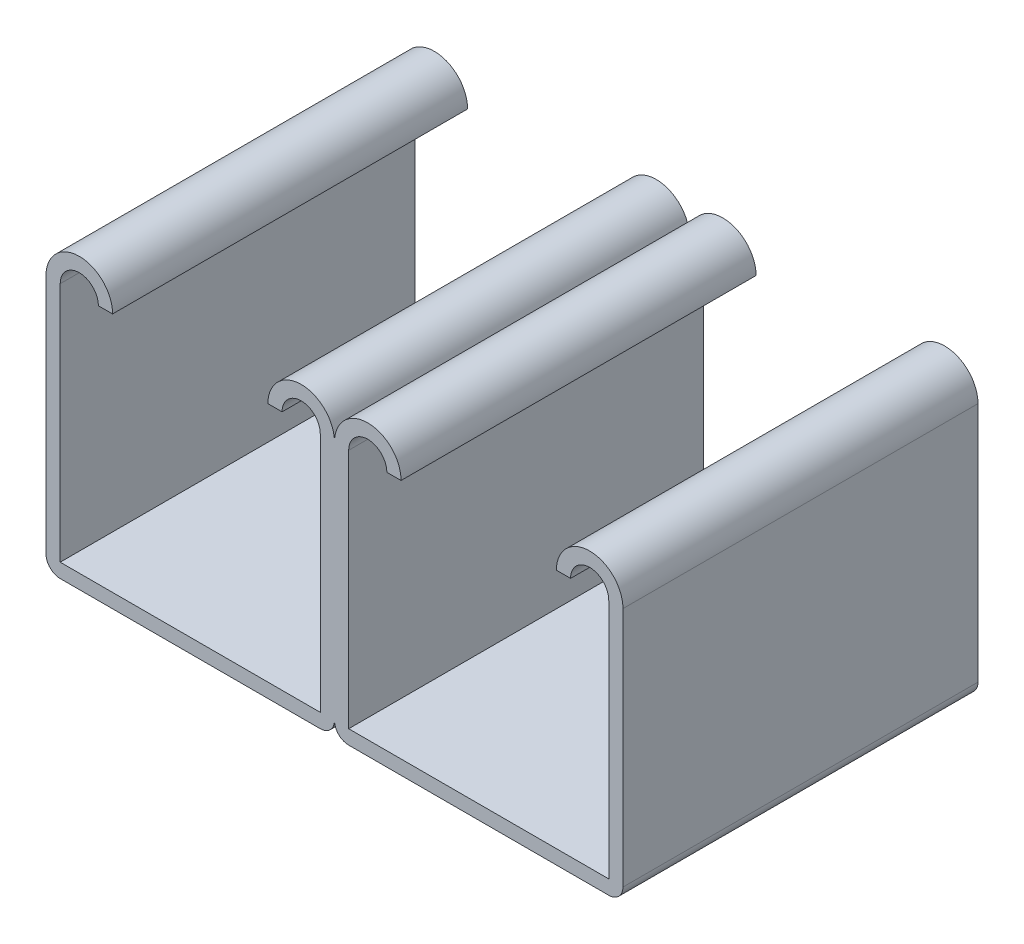
ISO-10303-21;
HEADER;
FILE_DESCRIPTION(('STEP AP214'),'2;1');
FILE_NAME('part.step','',(''),(''),'','','');
FILE_SCHEMA(('AUTOMOTIVE_DESIGN { 1 0 10303 214 1 1 1 1 }'));
ENDSEC;
DATA;
#1=APPLICATION_CONTEXT('core data for automotive mechanical design processes');
#2=APPLICATION_PROTOCOL_DEFINITION('international standard','automotive_design',2000,#1);
#3=PRODUCT_CONTEXT('',#1,'mechanical');
#4=PRODUCT('Part','Part','',(#3));
#5=PRODUCT_RELATED_PRODUCT_CATEGORY('part','',(#4));
#6=PRODUCT_DEFINITION_FORMATION('','',#4);
#7=PRODUCT_DEFINITION_CONTEXT('part definition',#1,'design');
#8=PRODUCT_DEFINITION('design','',#6,#7);
#9=PRODUCT_DEFINITION_SHAPE('','',#8);
#10=(LENGTH_UNIT() NAMED_UNIT(*) SI_UNIT(.MILLI.,.METRE.));
#11=(NAMED_UNIT(*) PLANE_ANGLE_UNIT() SI_UNIT($,.RADIAN.));
#12=(NAMED_UNIT(*) SI_UNIT($,.STERADIAN.) SOLID_ANGLE_UNIT());
#13=UNCERTAINTY_MEASURE_WITH_UNIT(LENGTH_MEASURE(1.E-05),#10,'distance_accuracy_value','');
#14=(GEOMETRIC_REPRESENTATION_CONTEXT(3) GLOBAL_UNCERTAINTY_ASSIGNED_CONTEXT((#13)) GLOBAL_UNIT_ASSIGNED_CONTEXT((#10,
#11,#12)) REPRESENTATION_CONTEXT('',''));
#15=CARTESIAN_POINT('',(0.,0.,0.));
#16=DIRECTION('',(0.,0.,1.));
#17=DIRECTION('',(1.,0.,0.));
#18=AXIS2_PLACEMENT_3D('',#15,#16,#17);
#19=CARTESIAN_POINT('',(-18.25625,9.37895,12.7));
#20=DIRECTION('',(0.,0.,-1.));
#21=DIRECTION('',(-1.,0.,0.));
#22=AXIS2_PLACEMENT_3D('',#19,#20,#21);
#23=CYLINDRICAL_SURFACE('',#22,2.38125);
#24=CARTESIAN_POINT('',(-18.25625,9.37895,-12.7));
#25=DIRECTION('',(0.,0.,1.));
#26=DIRECTION('',(-1.,0.,0.));
#27=AXIS2_PLACEMENT_3D('',#24,#25,#26);
#28=CIRCLE('',#27,2.38125);
#29=CARTESIAN_POINT('',(-15.875,9.37895,-12.7));
#30=VERTEX_POINT('',#29);
#31=CARTESIAN_POINT('',(-20.6375,9.37895,-12.7));
#32=VERTEX_POINT('',#31);
#33=EDGE_CURVE('E165',#30,#32,#28,.T.);
#34=ORIENTED_EDGE('',*,*,#33,.T.);
#35=DIRECTION('',(0.,0.,-1.));
#36=VECTOR('',#35,1.);
#37=CARTESIAN_POINT('',(-20.6375,9.37895,12.7));
#38=LINE('',#37,#36);
#39=CARTESIAN_POINT('',(-20.6375,9.37895,12.7));
#40=VERTEX_POINT('',#39);
#41=EDGE_CURVE('E11',#40,#32,#38,.T.);
#42=ORIENTED_EDGE('',*,*,#41,.F.);
#43=CARTESIAN_POINT('',(-18.25625,9.37895,12.7));
#44=DIRECTION('',(0.,0.,1.));
#45=DIRECTION('',(-1.,0.,0.));
#46=AXIS2_PLACEMENT_3D('',#43,#44,#45);
#47=CIRCLE('',#46,2.38125);
#48=CARTESIAN_POINT('',(-15.875,9.37895,12.7));
#49=VERTEX_POINT('',#48);
#50=EDGE_CURVE('E190',#49,#40,#47,.T.);
#51=ORIENTED_EDGE('',*,*,#50,.F.);
#52=DIRECTION('',(0.,0.,-1.));
#53=VECTOR('',#52,1.);
#54=CARTESIAN_POINT('',(-15.875,9.37895,12.7));
#55=LINE('',#54,#53);
#56=EDGE_CURVE('E161',#49,#30,#55,.T.);
#57=ORIENTED_EDGE('',*,*,#56,.T.);
#58=EDGE_LOOP('',(#34,#42,#51,#57));
#59=FACE_BOUND('',#58,.T.);
#60=ADVANCED_FACE('F32',(#59),#23,.T.);
#61=CARTESIAN_POINT('',(-20.6375,9.37895,12.7));
#62=DIRECTION('',(1.,0.,0.));
#63=DIRECTION('',(0.,1.,0.));
#64=AXIS2_PLACEMENT_3D('',#61,#62,#63);
#65=PLANE('',#64);
#66=DIRECTION('',(0.,-1.,0.));
#67=VECTOR('',#66,1.);
#68=CARTESIAN_POINT('',(-20.6375,9.37895,-12.7));
#69=LINE('',#68,#67);
#70=CARTESIAN_POINT('',(-20.6375,-7.874,-12.7));
#71=VERTEX_POINT('',#70);
#72=EDGE_CURVE('E168',#32,#71,#69,.T.);
#73=ORIENTED_EDGE('',*,*,#72,.T.);
#74=DIRECTION('',(0.,0.,-1.));
#75=VECTOR('',#74,1.);
#76=CARTESIAN_POINT('',(-20.6375,-7.874,12.7));
#77=LINE('',#76,#75);
#78=CARTESIAN_POINT('',(-20.6375,-7.874,12.7));
#79=VERTEX_POINT('',#78);
#80=EDGE_CURVE('E40',#79,#71,#77,.T.);
#81=ORIENTED_EDGE('',*,*,#80,.F.);
#82=DIRECTION('',(0.,-1.,0.));
#83=VECTOR('',#82,1.);
#84=CARTESIAN_POINT('',(-20.6375,9.37895,12.7));
#85=LINE('',#84,#83);
#86=EDGE_CURVE('E107',#40,#79,#85,.T.);
#87=ORIENTED_EDGE('',*,*,#86,.F.);
#88=ORIENTED_EDGE('',*,*,#41,.T.);
#89=EDGE_LOOP('',(#73,#81,#87,#88));
#90=FACE_BOUND('',#89,.T.);
#91=ADVANCED_FACE('F277',(#90),#65,.F.);
#92=CARTESIAN_POINT('',(-19.6215,-7.874,12.7));
#93=DIRECTION('',(0.,0.,-1.));
#94=DIRECTION('',(-1.,0.,0.));
#95=AXIS2_PLACEMENT_3D('',#92,#93,#94);
#96=CYLINDRICAL_SURFACE('',#95,1.016);
#97=CARTESIAN_POINT('',(-19.6215,-7.874,-12.7));
#98=DIRECTION('',(0.,0.,1.));
#99=DIRECTION('',(-1.,0.,0.));
#100=AXIS2_PLACEMENT_3D('',#97,#98,#99);
#101=CIRCLE('',#100,1.016);
#102=CARTESIAN_POINT('',(-19.6215,-8.89,-12.7));
#103=VERTEX_POINT('',#102);
#104=EDGE_CURVE('E171',#71,#103,#101,.T.);
#105=ORIENTED_EDGE('',*,*,#104,.T.);
#106=DIRECTION('',(0.,0.,-1.));
#107=VECTOR('',#106,1.);
#108=CARTESIAN_POINT('',(-19.6215,-8.89,12.7));
#109=LINE('',#108,#107);
#110=CARTESIAN_POINT('',(-19.6215,-8.89,12.7));
#111=VERTEX_POINT('',#110);
#112=EDGE_CURVE('E215',#111,#103,#109,.T.);
#113=ORIENTED_EDGE('',*,*,#112,.F.);
#114=CARTESIAN_POINT('',(-19.6215,-7.874,12.7));
#115=DIRECTION('',(0.,0.,1.));
#116=DIRECTION('',(-1.,0.,0.));
#117=AXIS2_PLACEMENT_3D('',#114,#115,#116);
#118=CIRCLE('',#117,1.016);
#119=EDGE_CURVE('E223',#79,#111,#118,.T.);
#120=ORIENTED_EDGE('',*,*,#119,.F.);
#121=ORIENTED_EDGE('',*,*,#80,.T.);
#122=EDGE_LOOP('',(#105,#113,#120,#121));
#123=FACE_BOUND('',#122,.T.);
#124=ADVANCED_FACE('F221',(#123),#96,.T.);
#125=CARTESIAN_POINT('',(-19.6215,-8.89,12.7));
#126=DIRECTION('',(0.,1.,0.));
#127=DIRECTION('',(-1.,0.,0.));
#128=AXIS2_PLACEMENT_3D('',#125,#126,#127);
#129=PLANE('',#128);
#130=DIRECTION('',(1.,0.,0.));
#131=VECTOR('',#130,1.);
#132=CARTESIAN_POINT('',(-19.6215,-8.89,-12.7));
#133=LINE('',#132,#131);
#134=CARTESIAN_POINT('',(-1.016,-8.89,-12.7));
#135=VERTEX_POINT('',#134);
#136=EDGE_CURVE('E173',#103,#135,#133,.T.);
#137=ORIENTED_EDGE('',*,*,#136,.T.);
#138=DIRECTION('',(0.,0.,-1.));
#139=VECTOR('',#138,1.);
#140=CARTESIAN_POINT('',(-1.016,-8.89,12.7));
#141=LINE('',#140,#139);
#142=CARTESIAN_POINT('',(-1.016,-8.89,12.7));
#143=VERTEX_POINT('',#142);
#144=EDGE_CURVE('E212',#143,#135,#141,.T.);
#145=ORIENTED_EDGE('',*,*,#144,.F.);
#146=DIRECTION('',(1.,0.,0.));
#147=VECTOR('',#146,1.);
#148=CARTESIAN_POINT('',(-19.6215,-8.89,12.7));
#149=LINE('',#148,#147);
#150=EDGE_CURVE('E242',#111,#143,#149,.T.);
#151=ORIENTED_EDGE('',*,*,#150,.F.);
#152=ORIENTED_EDGE('',*,*,#112,.T.);
#153=EDGE_LOOP('',(#137,#145,#151,#152));
#154=FACE_BOUND('',#153,.T.);
#155=ADVANCED_FACE('F232',(#154),#129,.F.);
#156=CARTESIAN_POINT('',(-1.016,-7.874,12.7));
#157=DIRECTION('',(0.,0.,-1.));
#158=DIRECTION('',(-1.,0.,0.));
#159=AXIS2_PLACEMENT_3D('',#156,#157,#158);
#160=CYLINDRICAL_SURFACE('',#159,1.016);
#161=CARTESIAN_POINT('',(-1.016,-7.874,-12.7));
#162=DIRECTION('',(0.,0.,1.));
#163=DIRECTION('',(1.,0.,0.));
#164=AXIS2_PLACEMENT_3D('',#161,#162,#163);
#165=CIRCLE('',#164,1.016);
#166=CARTESIAN_POINT('',(0.,-7.874,-12.7));
#167=VERTEX_POINT('',#166);
#168=EDGE_CURVE('E175',#135,#167,#165,.T.);
#169=ORIENTED_EDGE('',*,*,#168,.T.);
#170=DIRECTION('',(0.,0.,-1.));
#171=VECTOR('',#170,1.);
#172=CARTESIAN_POINT('',(0.,-7.874,12.7));
#173=LINE('',#172,#171);
#174=CARTESIAN_POINT('',(0.,-7.874,12.7));
#175=VERTEX_POINT('',#174);
#176=EDGE_CURVE('E209',#175,#167,#173,.T.);
#177=ORIENTED_EDGE('',*,*,#176,.F.);
#178=CARTESIAN_POINT('',(-1.016,-7.874,12.7));
#179=DIRECTION('',(0.,0.,1.));
#180=DIRECTION('',(1.,0.,0.));
#181=AXIS2_PLACEMENT_3D('',#178,#179,#180);
#182=CIRCLE('',#181,1.016);
#183=EDGE_CURVE('E238',#143,#175,#182,.T.);
#184=ORIENTED_EDGE('',*,*,#183,.F.);
#185=ORIENTED_EDGE('',*,*,#144,.T.);
#186=EDGE_LOOP('',(#169,#177,#184,#185));
#187=FACE_BOUND('',#186,.T.);
#188=ADVANCED_FACE('F236',(#187),#160,.T.);
#189=CARTESIAN_POINT('',(-2.38125,9.37895,12.7));
#190=DIRECTION('',(0.,0.,-1.));
#191=DIRECTION('',(-1.,0.,0.));
#192=AXIS2_PLACEMENT_3D('',#189,#190,#191);
#193=CYLINDRICAL_SURFACE('',#192,2.38125);
#194=CARTESIAN_POINT('',(-2.38125,9.37895,-12.7));
#195=DIRECTION('',(0.,0.,1.));
#196=DIRECTION('',(1.,0.,0.));
#197=AXIS2_PLACEMENT_3D('',#194,#195,#196);
#198=CIRCLE('',#197,2.38125);
#199=CARTESIAN_POINT('',(0.,9.37895,-12.7));
#200=VERTEX_POINT('',#199);
#201=CARTESIAN_POINT('',(-4.7625,9.37895,-12.7));
#202=VERTEX_POINT('',#201);
#203=EDGE_CURVE('E177',#200,#202,#198,.T.);
#204=ORIENTED_EDGE('',*,*,#203,.T.);
#205=DIRECTION('',(0.,0.,-1.));
#206=VECTOR('',#205,1.);
#207=CARTESIAN_POINT('',(-4.7625,9.37895,12.7));
#208=LINE('',#207,#206);
#209=CARTESIAN_POINT('',(-4.7625,9.37895,12.7));
#210=VERTEX_POINT('',#209);
#211=EDGE_CURVE('E203',#210,#202,#208,.T.);
#212=ORIENTED_EDGE('',*,*,#211,.F.);
#213=CARTESIAN_POINT('',(-2.38125,9.37895,12.7));
#214=DIRECTION('',(0.,0.,1.));
#215=DIRECTION('',(1.,0.,0.));
#216=AXIS2_PLACEMENT_3D('',#213,#214,#215);
#217=CIRCLE('',#216,2.38125);
#218=CARTESIAN_POINT('',(0.,9.37895,12.7));
#219=VERTEX_POINT('',#218);
#220=EDGE_CURVE('E241',#219,#210,#217,.T.);
#221=ORIENTED_EDGE('',*,*,#220,.F.);
#222=DIRECTION('',(0.,0.,-1.));
#223=VECTOR('',#222,1.);
#224=CARTESIAN_POINT('',(0.,9.37895,12.7));
#225=LINE('',#224,#223);
#226=EDGE_CURVE('E206',#219,#200,#225,.T.);
#227=ORIENTED_EDGE('',*,*,#226,.T.);
#228=EDGE_LOOP('',(#204,#212,#221,#227));
#229=FACE_BOUND('',#228,.T.);
#230=ADVANCED_FACE('F290',(#229),#193,.T.);
#231=CARTESIAN_POINT('',(-4.7625,9.37895,12.7));
#232=DIRECTION('',(0.,1.,0.));
#233=DIRECTION('',(0.,0.,1.));
#234=AXIS2_PLACEMENT_3D('',#231,#232,#233);
#235=PLANE('',#234);
#236=DIRECTION('',(1.,0.,0.));
#237=VECTOR('',#236,1.);
#238=CARTESIAN_POINT('',(-4.7625,9.37895,-12.7));
#239=LINE('',#238,#237);
#240=CARTESIAN_POINT('',(-3.7465,9.37895,-12.7));
#241=VERTEX_POINT('',#240);
#242=EDGE_CURVE('E179',#202,#241,#239,.T.);
#243=ORIENTED_EDGE('',*,*,#242,.T.);
#244=DIRECTION('',(0.,0.,-1.));
#245=VECTOR('',#244,1.);
#246=CARTESIAN_POINT('',(-3.7465,9.37895,12.7));
#247=LINE('',#246,#245);
#248=CARTESIAN_POINT('',(-3.7465,9.37895,12.7));
#249=VERTEX_POINT('',#248);
#250=EDGE_CURVE('E200',#249,#241,#247,.T.);
#251=ORIENTED_EDGE('',*,*,#250,.F.);
#252=DIRECTION('',(1.,0.,0.));
#253=VECTOR('',#252,1.);
#254=CARTESIAN_POINT('',(-4.7625,9.37895,12.7));
#255=LINE('',#254,#253);
#256=EDGE_CURVE('E244',#210,#249,#255,.T.);
#257=ORIENTED_EDGE('',*,*,#256,.F.);
#258=ORIENTED_EDGE('',*,*,#211,.T.);
#259=EDGE_LOOP('',(#243,#251,#257,#258));
#260=FACE_BOUND('',#259,.T.);
#261=ADVANCED_FACE('F293',(#260),#235,.F.);
#262=CARTESIAN_POINT('',(-2.38125,9.37895,12.7));
#263=DIRECTION('',(0.,0.,-1.));
#264=DIRECTION('',(-1.,0.,0.));
#265=AXIS2_PLACEMENT_3D('',#262,#263,#264);
#266=CYLINDRICAL_SURFACE('',#265,1.36525);
#267=CARTESIAN_POINT('',(-2.38125,9.37895,-12.7));
#268=DIRECTION('',(0.,0.,-1.));
#269=DIRECTION('',(1.,0.,0.));
#270=AXIS2_PLACEMENT_3D('',#267,#268,#269);
#271=CIRCLE('',#270,1.36525);
#272=CARTESIAN_POINT('',(-1.016,9.37895,-12.7));
#273=VERTEX_POINT('',#272);
#274=EDGE_CURVE('E181',#241,#273,#271,.T.);
#275=ORIENTED_EDGE('',*,*,#274,.T.);
#276=DIRECTION('',(0.,0.,-1.));
#277=VECTOR('',#276,1.);
#278=CARTESIAN_POINT('',(-1.016,9.37895,12.7));
#279=LINE('',#278,#277);
#280=CARTESIAN_POINT('',(-1.016,9.37895,12.7));
#281=VERTEX_POINT('',#280);
#282=EDGE_CURVE('E197',#281,#273,#279,.T.);
#283=ORIENTED_EDGE('',*,*,#282,.F.);
#284=CARTESIAN_POINT('',(-2.38125,9.37895,12.7));
#285=DIRECTION('',(0.,0.,-1.));
#286=DIRECTION('',(1.,0.,0.));
#287=AXIS2_PLACEMENT_3D('',#284,#285,#286);
#288=CIRCLE('',#287,1.36525);
#289=EDGE_CURVE('E250',#249,#281,#288,.T.);
#290=ORIENTED_EDGE('',*,*,#289,.F.);
#291=ORIENTED_EDGE('',*,*,#250,.T.);
#292=EDGE_LOOP('',(#275,#283,#290,#291));
#293=FACE_BOUND('',#292,.T.);
#294=ADVANCED_FACE('F297',(#293),#266,.F.);
#295=CARTESIAN_POINT('',(-1.016,-7.874,12.7));
#296=DIRECTION('',(1.,0.,0.));
#297=DIRECTION('',(0.,0.,-1.));
#298=AXIS2_PLACEMENT_3D('',#295,#296,#297);
#299=PLANE('',#298);
#300=DIRECTION('',(0.,-1.,0.));
#301=VECTOR('',#300,1.);
#302=CARTESIAN_POINT('',(-1.016,-7.874,-12.7));
#303=LINE('',#302,#301);
#304=CARTESIAN_POINT('',(-1.016,-7.874,-12.7));
#305=VERTEX_POINT('',#304);
#306=EDGE_CURVE('E183',#273,#305,#303,.T.);
#307=ORIENTED_EDGE('',*,*,#306,.T.);
#308=DIRECTION('',(0.,0.,-1.));
#309=VECTOR('',#308,1.);
#310=CARTESIAN_POINT('',(-1.016,-7.874,12.7));
#311=LINE('',#310,#309);
#312=CARTESIAN_POINT('',(-1.016,-7.874,12.7));
#313=VERTEX_POINT('',#312);
#314=EDGE_CURVE('E194',#313,#305,#311,.T.);
#315=ORIENTED_EDGE('',*,*,#314,.F.);
#316=DIRECTION('',(0.,-1.,0.));
#317=VECTOR('',#316,1.);
#318=CARTESIAN_POINT('',(-1.016,-7.874,12.7));
#319=LINE('',#318,#317);
#320=EDGE_CURVE('E252',#281,#313,#319,.T.);
#321=ORIENTED_EDGE('',*,*,#320,.F.);
#322=ORIENTED_EDGE('',*,*,#282,.T.);
#323=EDGE_LOOP('',(#307,#315,#321,#322));
#324=FACE_BOUND('',#323,.T.);
#325=ADVANCED_FACE('F258',(#324),#299,.F.);
#326=CARTESIAN_POINT('',(-19.6215,-7.874,12.7));
#327=DIRECTION('',(0.,-1.,0.));
#328=DIRECTION('',(0.,0.,-1.));
#329=AXIS2_PLACEMENT_3D('',#326,#327,#328);
#330=PLANE('',#329);
#331=DIRECTION('',(-1.,0.,0.));
#332=VECTOR('',#331,1.);
#333=CARTESIAN_POINT('',(-19.6215,-7.874,-12.7));
#334=LINE('',#333,#332);
#335=CARTESIAN_POINT('',(-19.6215,-7.874,-12.7));
#336=VERTEX_POINT('',#335);
#337=EDGE_CURVE('E185',#305,#336,#334,.T.);
#338=ORIENTED_EDGE('',*,*,#337,.T.);
#339=DIRECTION('',(0.,0.,-1.));
#340=VECTOR('',#339,1.);
#341=CARTESIAN_POINT('',(-19.6215,-7.874,12.7));
#342=LINE('',#341,#340);
#343=CARTESIAN_POINT('',(-19.6215,-7.874,12.7));
#344=VERTEX_POINT('',#343);
#345=EDGE_CURVE('E156',#344,#336,#342,.T.);
#346=ORIENTED_EDGE('',*,*,#345,.F.);
#347=DIRECTION('',(-1.,0.,0.));
#348=VECTOR('',#347,1.);
#349=CARTESIAN_POINT('',(-19.6215,-7.874,12.7));
#350=LINE('',#349,#348);
#351=EDGE_CURVE('E147',#313,#344,#350,.T.);
#352=ORIENTED_EDGE('',*,*,#351,.F.);
#353=ORIENTED_EDGE('',*,*,#314,.T.);
#354=EDGE_LOOP('',(#338,#346,#352,#353));
#355=FACE_BOUND('',#354,.T.);
#356=ADVANCED_FACE('F262',(#355),#330,.F.);
#357=CARTESIAN_POINT('',(-19.6215,9.37895,12.7));
#358=DIRECTION('',(-1.,0.,0.));
#359=DIRECTION('',(0.,0.,1.));
#360=AXIS2_PLACEMENT_3D('',#357,#358,#359);
#361=PLANE('',#360);
#362=DIRECTION('',(0.,1.,0.));
#363=VECTOR('',#362,1.);
#364=CARTESIAN_POINT('',(-19.6215,9.37895,-12.7));
#365=LINE('',#364,#363);
#366=CARTESIAN_POINT('',(-19.6215,9.37895,-12.7));
#367=VERTEX_POINT('',#366);
#368=EDGE_CURVE('E155',#336,#367,#365,.T.);
#369=ORIENTED_EDGE('',*,*,#368,.T.);
#370=DIRECTION('',(0.,0.,-1.));
#371=VECTOR('',#370,1.);
#372=CARTESIAN_POINT('',(-19.6215,9.37895,12.7));
#373=LINE('',#372,#371);
#374=CARTESIAN_POINT('',(-19.6215,9.37895,12.7));
#375=VERTEX_POINT('',#374);
#376=EDGE_CURVE('E152',#375,#367,#373,.T.);
#377=ORIENTED_EDGE('',*,*,#376,.F.);
#378=DIRECTION('',(0.,1.,0.));
#379=VECTOR('',#378,1.);
#380=CARTESIAN_POINT('',(-19.6215,9.37895,12.7));
#381=LINE('',#380,#379);
#382=EDGE_CURVE('E141',#344,#375,#381,.T.);
#383=ORIENTED_EDGE('',*,*,#382,.F.);
#384=ORIENTED_EDGE('',*,*,#345,.T.);
#385=EDGE_LOOP('',(#369,#377,#383,#384));
#386=FACE_BOUND('',#385,.T.);
#387=ADVANCED_FACE('F153',(#386),#361,.F.);
#388=CARTESIAN_POINT('',(-18.25625,9.37895,12.7));
#389=DIRECTION('',(0.,0.,-1.));
#390=DIRECTION('',(-1.,0.,0.));
#391=AXIS2_PLACEMENT_3D('',#388,#389,#390);
#392=CYLINDRICAL_SURFACE('',#391,1.36525);
#393=CARTESIAN_POINT('',(-18.25625,9.37895,-12.7));
#394=DIRECTION('',(0.,0.,-1.));
#395=DIRECTION('',(-1.,0.,0.));
#396=AXIS2_PLACEMENT_3D('',#393,#394,#395);
#397=CIRCLE('',#396,1.36525);
#398=CARTESIAN_POINT('',(-16.891,9.37895,-12.7));
#399=VERTEX_POINT('',#398);
#400=EDGE_CURVE('E93',#367,#399,#397,.T.);
#401=ORIENTED_EDGE('',*,*,#400,.T.);
#402=DIRECTION('',(0.,0.,-1.));
#403=VECTOR('',#402,1.);
#404=CARTESIAN_POINT('',(-16.891,9.37895,12.7));
#405=LINE('',#404,#403);
#406=CARTESIAN_POINT('',(-16.891,9.37895,12.7));
#407=VERTEX_POINT('',#406);
#408=EDGE_CURVE('E157',#407,#399,#405,.T.);
#409=ORIENTED_EDGE('',*,*,#408,.F.);
#410=CARTESIAN_POINT('',(-18.25625,9.37895,12.7));
#411=DIRECTION('',(0.,0.,-1.));
#412=DIRECTION('',(-1.,0.,0.));
#413=AXIS2_PLACEMENT_3D('',#410,#411,#412);
#414=CIRCLE('',#413,1.36525);
#415=EDGE_CURVE('E145',#375,#407,#414,.T.);
#416=ORIENTED_EDGE('',*,*,#415,.F.);
#417=ORIENTED_EDGE('',*,*,#376,.T.);
#418=EDGE_LOOP('',(#401,#409,#416,#417));
#419=FACE_BOUND('',#418,.T.);
#420=ADVANCED_FACE('F159',(#419),#392,.F.);
#421=CARTESIAN_POINT('',(-16.891,9.37895,12.7));
#422=DIRECTION('',(0.,1.,0.));
#423=DIRECTION('',(0.,0.,1.));
#424=AXIS2_PLACEMENT_3D('',#421,#422,#423);
#425=PLANE('',#424);
#426=DIRECTION('',(1.,0.,0.));
#427=VECTOR('',#426,1.);
#428=CARTESIAN_POINT('',(-16.891,9.37895,-12.7));
#429=LINE('',#428,#427);
#430=EDGE_CURVE('E99',#399,#30,#429,.T.);
#431=ORIENTED_EDGE('',*,*,#430,.T.);
#432=ORIENTED_EDGE('',*,*,#56,.F.);
#433=DIRECTION('',(1.,0.,0.));
#434=VECTOR('',#433,1.);
#435=CARTESIAN_POINT('',(-16.891,9.37895,12.7));
#436=LINE('',#435,#434);
#437=EDGE_CURVE('E48',#407,#49,#436,.T.);
#438=ORIENTED_EDGE('',*,*,#437,.F.);
#439=ORIENTED_EDGE('',*,*,#408,.T.);
#440=EDGE_LOOP('',(#431,#432,#438,#439));
#441=FACE_BOUND('',#440,.T.);
#442=ADVANCED_FACE('F266',(#441),#425,.F.);
#443=CARTESIAN_POINT('',(-18.25625,9.37895,12.7));
#444=DIRECTION('',(0.,0.,-1.));
#445=DIRECTION('',(-1.,0.,0.));
#446=AXIS2_PLACEMENT_3D('',#443,#444,#445);
#447=PLANE('',#446);
#448=ORIENTED_EDGE('',*,*,#50,.T.);
#449=ORIENTED_EDGE('',*,*,#86,.T.);
#450=ORIENTED_EDGE('',*,*,#119,.T.);
#451=ORIENTED_EDGE('',*,*,#150,.T.);
#452=ORIENTED_EDGE('',*,*,#183,.T.);
#453=CARTESIAN_POINT('',(1.016,-7.874,12.7));
#454=DIRECTION('',(0.,0.,1.));
#455=DIRECTION('',(-1.,0.,0.));
#456=AXIS2_PLACEMENT_3D('',#453,#454,#455);
#457=CIRCLE('',#456,1.016);
#458=CARTESIAN_POINT('',(1.016,-8.89,12.7));
#459=VERTEX_POINT('',#458);
#460=EDGE_CURVE('E669',#175,#459,#457,.T.);
#461=ORIENTED_EDGE('',*,*,#460,.T.);
#462=DIRECTION('',(1.,0.,0.));
#463=VECTOR('',#462,1.);
#464=CARTESIAN_POINT('',(1.016,-8.89,12.7));
#465=LINE('',#464,#463);
#466=CARTESIAN_POINT('',(19.6215,-8.89,12.7));
#467=VERTEX_POINT('',#466);
#468=EDGE_CURVE('E583',#459,#467,#465,.T.);
#469=ORIENTED_EDGE('',*,*,#468,.T.);
#470=CARTESIAN_POINT('',(19.6215,-7.874,12.7));
#471=DIRECTION('',(0.,0.,1.));
#472=DIRECTION('',(1.,0.,0.));
#473=AXIS2_PLACEMENT_3D('',#470,#471,#472);
#474=CIRCLE('',#473,1.016);
#475=CARTESIAN_POINT('',(20.6375,-7.874,12.7));
#476=VERTEX_POINT('',#475);
#477=EDGE_CURVE('E606',#467,#476,#474,.T.);
#478=ORIENTED_EDGE('',*,*,#477,.T.);
#479=DIRECTION('',(0.,1.,0.));
#480=VECTOR('',#479,1.);
#481=CARTESIAN_POINT('',(20.6375,-7.874,12.7));
#482=LINE('',#481,#480);
#483=CARTESIAN_POINT('',(20.6375,9.37895,12.7));
#484=VERTEX_POINT('',#483);
#485=EDGE_CURVE('E598',#476,#484,#482,.T.);
#486=ORIENTED_EDGE('',*,*,#485,.T.);
#487=CARTESIAN_POINT('',(18.25625,9.37895,12.7));
#488=DIRECTION('',(0.,0.,1.));
#489=DIRECTION('',(1.,0.,0.));
#490=AXIS2_PLACEMENT_3D('',#487,#488,#489);
#491=CIRCLE('',#490,2.38125);
#492=CARTESIAN_POINT('',(15.875,9.37895,12.7));
#493=VERTEX_POINT('',#492);
#494=EDGE_CURVE('E605',#484,#493,#491,.T.);
#495=ORIENTED_EDGE('',*,*,#494,.T.);
#496=DIRECTION('',(1.,0.,0.));
#497=VECTOR('',#496,1.);
#498=CARTESIAN_POINT('',(15.875,9.37895,12.7));
#499=LINE('',#498,#497);
#500=CARTESIAN_POINT('',(16.891,9.37895,12.7));
#501=VERTEX_POINT('',#500);
#502=EDGE_CURVE('E608',#493,#501,#499,.T.);
#503=ORIENTED_EDGE('',*,*,#502,.T.);
#504=CARTESIAN_POINT('',(18.25625,9.37895,12.7));
#505=DIRECTION('',(0.,0.,-1.));
#506=DIRECTION('',(1.,0.,0.));
#507=AXIS2_PLACEMENT_3D('',#504,#505,#506);
#508=CIRCLE('',#507,1.36525);
#509=CARTESIAN_POINT('',(19.6215,9.37895,12.7));
#510=VERTEX_POINT('',#509);
#511=EDGE_CURVE('E615',#501,#510,#508,.T.);
#512=ORIENTED_EDGE('',*,*,#511,.T.);
#513=DIRECTION('',(0.,-1.,0.));
#514=VECTOR('',#513,1.);
#515=CARTESIAN_POINT('',(19.6215,-7.874,12.7));
#516=LINE('',#515,#514);
#517=CARTESIAN_POINT('',(19.6215,-7.874,12.7));
#518=VERTEX_POINT('',#517);
#519=EDGE_CURVE('E618',#510,#518,#516,.T.);
#520=ORIENTED_EDGE('',*,*,#519,.T.);
#521=DIRECTION('',(-1.,0.,0.));
#522=VECTOR('',#521,1.);
#523=CARTESIAN_POINT('',(1.016,-7.874,12.7));
#524=LINE('',#523,#522);
#525=CARTESIAN_POINT('',(1.016,-7.874,12.7));
#526=VERTEX_POINT('',#525);
#527=EDGE_CURVE('E621',#518,#526,#524,.T.);
#528=ORIENTED_EDGE('',*,*,#527,.T.);
#529=DIRECTION('',(0.,1.,0.));
#530=VECTOR('',#529,1.);
#531=CARTESIAN_POINT('',(1.016,9.37895,12.7));
#532=LINE('',#531,#530);
#533=CARTESIAN_POINT('',(1.016,9.37895,12.7));
#534=VERTEX_POINT('',#533);
#535=EDGE_CURVE('E624',#526,#534,#532,.T.);
#536=ORIENTED_EDGE('',*,*,#535,.T.);
#537=CARTESIAN_POINT('',(2.38125,9.37895,12.7));
#538=DIRECTION('',(0.,0.,-1.));
#539=DIRECTION('',(-1.,0.,0.));
#540=AXIS2_PLACEMENT_3D('',#537,#538,#539);
#541=CIRCLE('',#540,1.36525);
#542=CARTESIAN_POINT('',(3.7465,9.37895,12.7));
#543=VERTEX_POINT('',#542);
#544=EDGE_CURVE('E626',#534,#543,#541,.T.);
#545=ORIENTED_EDGE('',*,*,#544,.T.);
#546=DIRECTION('',(1.,0.,0.));
#547=VECTOR('',#546,1.);
#548=CARTESIAN_POINT('',(3.7465,9.37895,12.7));
#549=LINE('',#548,#547);
#550=CARTESIAN_POINT('',(4.7625,9.37895,12.7));
#551=VERTEX_POINT('',#550);
#552=EDGE_CURVE('E505',#543,#551,#549,.T.);
#553=ORIENTED_EDGE('',*,*,#552,.T.);
#554=CARTESIAN_POINT('',(2.38125,9.37895,12.7));
#555=DIRECTION('',(0.,0.,1.));
#556=DIRECTION('',(-1.,0.,0.));
#557=AXIS2_PLACEMENT_3D('',#554,#555,#556);
#558=CIRCLE('',#557,2.38125);
#559=EDGE_CURVE('E497',#551,#219,#558,.T.);
#560=ORIENTED_EDGE('',*,*,#559,.T.);
#561=ORIENTED_EDGE('',*,*,#220,.T.);
#562=ORIENTED_EDGE('',*,*,#256,.T.);
#563=ORIENTED_EDGE('',*,*,#289,.T.);
#564=ORIENTED_EDGE('',*,*,#320,.T.);
#565=ORIENTED_EDGE('',*,*,#351,.T.);
#566=ORIENTED_EDGE('',*,*,#382,.T.);
#567=ORIENTED_EDGE('',*,*,#415,.T.);
#568=ORIENTED_EDGE('',*,*,#437,.T.);
#569=EDGE_LOOP('',(#448,#449,#450,#451,#452,#461,#469,#478,#486,#495,#503,#512,#520,#528,#536,
#545,#553,#560,#561,#562,#563,#564,#565,#566,#567,#568));
#570=FACE_BOUND('',#569,.T.);
#571=ADVANCED_FACE('F143',(#570),#447,.F.);
#572=CARTESIAN_POINT('',(-18.25625,9.37895,-12.7));
#573=DIRECTION('',(0.,0.,-1.));
#574=DIRECTION('',(-1.,0.,0.));
#575=AXIS2_PLACEMENT_3D('',#572,#573,#574);
#576=PLANE('',#575);
#577=ORIENTED_EDGE('',*,*,#33,.F.);
#578=ORIENTED_EDGE('',*,*,#430,.F.);
#579=ORIENTED_EDGE('',*,*,#400,.F.);
#580=ORIENTED_EDGE('',*,*,#368,.F.);
#581=ORIENTED_EDGE('',*,*,#337,.F.);
#582=ORIENTED_EDGE('',*,*,#306,.F.);
#583=ORIENTED_EDGE('',*,*,#274,.F.);
#584=ORIENTED_EDGE('',*,*,#242,.F.);
#585=ORIENTED_EDGE('',*,*,#203,.F.);
#586=CARTESIAN_POINT('',(2.38125,9.37895,-12.7));
#587=DIRECTION('',(0.,0.,1.));
#588=DIRECTION('',(-1.,0.,0.));
#589=AXIS2_PLACEMENT_3D('',#586,#587,#588);
#590=CIRCLE('',#589,2.38125);
#591=CARTESIAN_POINT('',(4.7625,9.37895,-12.7));
#592=VERTEX_POINT('',#591);
#593=EDGE_CURVE('E503',#592,#200,#590,.T.);
#594=ORIENTED_EDGE('',*,*,#593,.F.);
#595=DIRECTION('',(1.,0.,0.));
#596=VECTOR('',#595,1.);
#597=CARTESIAN_POINT('',(3.7465,9.37895,-12.7));
#598=LINE('',#597,#596);
#599=CARTESIAN_POINT('',(3.7465,9.37895,-12.7));
#600=VERTEX_POINT('',#599);
#601=EDGE_CURVE('E486',#600,#592,#598,.T.);
#602=ORIENTED_EDGE('',*,*,#601,.F.);
#603=CARTESIAN_POINT('',(2.38125,9.37895,-12.7));
#604=DIRECTION('',(0.,0.,-1.));
#605=DIRECTION('',(-1.,0.,0.));
#606=AXIS2_PLACEMENT_3D('',#603,#604,#605);
#607=CIRCLE('',#606,1.36525);
#608=CARTESIAN_POINT('',(1.016,9.37895,-12.7));
#609=VERTEX_POINT('',#608);
#610=EDGE_CURVE('E498',#609,#600,#607,.T.);
#611=ORIENTED_EDGE('',*,*,#610,.F.);
#612=DIRECTION('',(0.,1.,0.));
#613=VECTOR('',#612,1.);
#614=CARTESIAN_POINT('',(1.016,9.37895,-12.7));
#615=LINE('',#614,#613);
#616=CARTESIAN_POINT('',(1.016,-7.874,-12.7));
#617=VERTEX_POINT('',#616);
#618=EDGE_CURVE('E540',#617,#609,#615,.T.);
#619=ORIENTED_EDGE('',*,*,#618,.F.);
#620=DIRECTION('',(-1.,0.,0.));
#621=VECTOR('',#620,1.);
#622=CARTESIAN_POINT('',(1.016,-7.874,-12.7));
#623=LINE('',#622,#621);
#624=CARTESIAN_POINT('',(19.6215,-7.874,-12.7));
#625=VERTEX_POINT('',#624);
#626=EDGE_CURVE('E537',#625,#617,#623,.T.);
#627=ORIENTED_EDGE('',*,*,#626,.F.);
#628=DIRECTION('',(0.,-1.,0.));
#629=VECTOR('',#628,1.);
#630=CARTESIAN_POINT('',(19.6215,-7.874,-12.7));
#631=LINE('',#630,#629);
#632=CARTESIAN_POINT('',(19.6215,9.37895,-12.7));
#633=VERTEX_POINT('',#632);
#634=EDGE_CURVE('E534',#633,#625,#631,.T.);
#635=ORIENTED_EDGE('',*,*,#634,.F.);
#636=CARTESIAN_POINT('',(18.25625,9.37895,-12.7));
#637=DIRECTION('',(0.,0.,-1.));
#638=DIRECTION('',(1.,0.,0.));
#639=AXIS2_PLACEMENT_3D('',#636,#637,#638);
#640=CIRCLE('',#639,1.36525);
#641=CARTESIAN_POINT('',(16.891,9.37895,-12.7));
#642=VERTEX_POINT('',#641);
#643=EDGE_CURVE('E531',#642,#633,#640,.T.);
#644=ORIENTED_EDGE('',*,*,#643,.F.);
#645=DIRECTION('',(1.,0.,0.));
#646=VECTOR('',#645,1.);
#647=CARTESIAN_POINT('',(15.875,9.37895,-12.7));
#648=LINE('',#647,#646);
#649=CARTESIAN_POINT('',(15.875,9.37895,-12.7));
#650=VERTEX_POINT('',#649);
#651=EDGE_CURVE('E528',#650,#642,#648,.T.);
#652=ORIENTED_EDGE('',*,*,#651,.F.);
#653=CARTESIAN_POINT('',(18.25625,9.37895,-12.7));
#654=DIRECTION('',(0.,0.,1.));
#655=DIRECTION('',(1.,0.,0.));
#656=AXIS2_PLACEMENT_3D('',#653,#654,#655);
#657=CIRCLE('',#656,2.38125);
#658=CARTESIAN_POINT('',(20.6375,9.37895,-12.7));
#659=VERTEX_POINT('',#658);
#660=EDGE_CURVE('E525',#659,#650,#657,.T.);
#661=ORIENTED_EDGE('',*,*,#660,.F.);
#662=DIRECTION('',(0.,1.,0.));
#663=VECTOR('',#662,1.);
#664=CARTESIAN_POINT('',(20.6375,-7.874,-12.7));
#665=LINE('',#664,#663);
#666=CARTESIAN_POINT('',(20.6375,-7.874,-12.7));
#667=VERTEX_POINT('',#666);
#668=EDGE_CURVE('E522',#667,#659,#665,.T.);
#669=ORIENTED_EDGE('',*,*,#668,.F.);
#670=CARTESIAN_POINT('',(19.6215,-7.874,-12.7));
#671=DIRECTION('',(0.,0.,1.));
#672=DIRECTION('',(1.,0.,0.));
#673=AXIS2_PLACEMENT_3D('',#670,#671,#672);
#674=CIRCLE('',#673,1.016);
#675=CARTESIAN_POINT('',(19.6215,-8.89,-12.7));
#676=VERTEX_POINT('',#675);
#677=EDGE_CURVE('E519',#676,#667,#674,.T.);
#678=ORIENTED_EDGE('',*,*,#677,.F.);
#679=DIRECTION('',(1.,0.,0.));
#680=VECTOR('',#679,1.);
#681=CARTESIAN_POINT('',(1.016,-8.89,-12.7));
#682=LINE('',#681,#680);
#683=CARTESIAN_POINT('',(1.016,-8.89,-12.7));
#684=VERTEX_POINT('',#683);
#685=EDGE_CURVE('E512',#684,#676,#682,.T.);
#686=ORIENTED_EDGE('',*,*,#685,.F.);
#687=CARTESIAN_POINT('',(1.016,-7.874,-12.7));
#688=DIRECTION('',(0.,0.,1.));
#689=DIRECTION('',(-1.,0.,0.));
#690=AXIS2_PLACEMENT_3D('',#687,#688,#689);
#691=CIRCLE('',#690,1.016);
#692=EDGE_CURVE('E509',#167,#684,#691,.T.);
#693=ORIENTED_EDGE('',*,*,#692,.F.);
#694=ORIENTED_EDGE('',*,*,#168,.F.);
#695=ORIENTED_EDGE('',*,*,#136,.F.);
#696=ORIENTED_EDGE('',*,*,#104,.F.);
#697=ORIENTED_EDGE('',*,*,#72,.F.);
#698=EDGE_LOOP('',(#577,#578,#579,#580,#581,#582,#583,#584,#585,#594,#602,#611,#619,#627,#635,
#644,#652,#661,#669,#678,#686,#693,#694,#695,#696,#697));
#699=FACE_BOUND('',#698,.T.);
#700=ADVANCED_FACE('F227',(#699),#576,.T.);
#701=CARTESIAN_POINT('',(2.38125,9.37895,12.7));
#702=DIRECTION('',(0.,0.,-1.));
#703=DIRECTION('',(-1.,0.,0.));
#704=AXIS2_PLACEMENT_3D('',#701,#702,#703);
#705=CYLINDRICAL_SURFACE('',#704,2.38125);
#706=ORIENTED_EDGE('',*,*,#593,.T.);
#707=ORIENTED_EDGE('',*,*,#226,.F.);
#708=ORIENTED_EDGE('',*,*,#559,.F.);
#709=DIRECTION('',(0.,0.,-1.));
#710=VECTOR('',#709,1.);
#711=CARTESIAN_POINT('',(4.7625,9.37895,12.7));
#712=LINE('',#711,#710);
#713=EDGE_CURVE('E489',#551,#592,#712,.T.);
#714=ORIENTED_EDGE('',*,*,#713,.T.);
#715=EDGE_LOOP('',(#706,#707,#708,#714));
#716=FACE_BOUND('',#715,.T.);
#717=ADVANCED_FACE('F350',(#716),#705,.T.);
#718=CARTESIAN_POINT('',(1.016,-7.874,12.7));
#719=DIRECTION('',(0.,0.,-1.));
#720=DIRECTION('',(-1.,0.,0.));
#721=AXIS2_PLACEMENT_3D('',#718,#719,#720);
#722=CYLINDRICAL_SURFACE('',#721,1.016);
#723=ORIENTED_EDGE('',*,*,#692,.T.);
#724=DIRECTION('',(0.,0.,-1.));
#725=VECTOR('',#724,1.);
#726=CARTESIAN_POINT('',(1.016,-8.89,12.7));
#727=LINE('',#726,#725);
#728=EDGE_CURVE('E169',#459,#684,#727,.T.);
#729=ORIENTED_EDGE('',*,*,#728,.F.);
#730=ORIENTED_EDGE('',*,*,#460,.F.);
#731=ORIENTED_EDGE('',*,*,#176,.T.);
#732=EDGE_LOOP('',(#723,#729,#730,#731));
#733=FACE_BOUND('',#732,.T.);
#734=ADVANCED_FACE('F358',(#733),#722,.T.);
#735=CARTESIAN_POINT('',(1.016,-8.89,12.7));
#736=DIRECTION('',(0.,1.,0.));
#737=DIRECTION('',(-1.,0.,0.));
#738=AXIS2_PLACEMENT_3D('',#735,#736,#737);
#739=PLANE('',#738);
#740=ORIENTED_EDGE('',*,*,#685,.T.);
#741=DIRECTION('',(0.,0.,-1.));
#742=VECTOR('',#741,1.);
#743=CARTESIAN_POINT('',(19.6215,-8.89,12.7));
#744=LINE('',#743,#742);
#745=EDGE_CURVE('E570',#467,#676,#744,.T.);
#746=ORIENTED_EDGE('',*,*,#745,.F.);
#747=ORIENTED_EDGE('',*,*,#468,.F.);
#748=ORIENTED_EDGE('',*,*,#728,.T.);
#749=EDGE_LOOP('',(#740,#746,#747,#748));
#750=FACE_BOUND('',#749,.T.);
#751=ADVANCED_FACE('F368',(#750),#739,.F.);
#752=CARTESIAN_POINT('',(19.6215,-7.874,12.7));
#753=DIRECTION('',(0.,0.,-1.));
#754=DIRECTION('',(-1.,0.,0.));
#755=AXIS2_PLACEMENT_3D('',#752,#753,#754);
#756=CYLINDRICAL_SURFACE('',#755,1.016);
#757=ORIENTED_EDGE('',*,*,#677,.T.);
#758=DIRECTION('',(0.,0.,-1.));
#759=VECTOR('',#758,1.);
#760=CARTESIAN_POINT('',(20.6375,-7.874,12.7));
#761=LINE('',#760,#759);
#762=EDGE_CURVE('E567',#476,#667,#761,.T.);
#763=ORIENTED_EDGE('',*,*,#762,.F.);
#764=ORIENTED_EDGE('',*,*,#477,.F.);
#765=ORIENTED_EDGE('',*,*,#745,.T.);
#766=EDGE_LOOP('',(#757,#763,#764,#765));
#767=FACE_BOUND('',#766,.T.);
#768=ADVANCED_FACE('F378',(#767),#756,.T.);
#769=CARTESIAN_POINT('',(20.6375,-7.874,12.7));
#770=DIRECTION('',(-1.,0.,0.));
#771=DIRECTION('',(0.,0.,1.));
#772=AXIS2_PLACEMENT_3D('',#769,#770,#771);
#773=PLANE('',#772);
#774=ORIENTED_EDGE('',*,*,#668,.T.);
#775=DIRECTION('',(0.,0.,-1.));
#776=VECTOR('',#775,1.);
#777=CARTESIAN_POINT('',(20.6375,9.37895,12.7));
#778=LINE('',#777,#776);
#779=EDGE_CURVE('E564',#484,#659,#778,.T.);
#780=ORIENTED_EDGE('',*,*,#779,.F.);
#781=ORIENTED_EDGE('',*,*,#485,.F.);
#782=ORIENTED_EDGE('',*,*,#762,.T.);
#783=EDGE_LOOP('',(#774,#780,#781,#782));
#784=FACE_BOUND('',#783,.T.);
#785=ADVANCED_FACE('F388',(#784),#773,.F.);
#786=CARTESIAN_POINT('',(18.25625,9.37895,12.7));
#787=DIRECTION('',(0.,0.,-1.));
#788=DIRECTION('',(-1.,0.,0.));
#789=AXIS2_PLACEMENT_3D('',#786,#787,#788);
#790=CYLINDRICAL_SURFACE('',#789,2.38125);
#791=ORIENTED_EDGE('',*,*,#660,.T.);
#792=DIRECTION('',(0.,0.,-1.));
#793=VECTOR('',#792,1.);
#794=CARTESIAN_POINT('',(15.875,9.37895,12.7));
#795=LINE('',#794,#793);
#796=EDGE_CURVE('E561',#493,#650,#795,.T.);
#797=ORIENTED_EDGE('',*,*,#796,.F.);
#798=ORIENTED_EDGE('',*,*,#494,.F.);
#799=ORIENTED_EDGE('',*,*,#779,.T.);
#800=EDGE_LOOP('',(#791,#797,#798,#799));
#801=FACE_BOUND('',#800,.T.);
#802=ADVANCED_FACE('F398',(#801),#790,.T.);
#803=CARTESIAN_POINT('',(15.875,9.37895,12.7));
#804=DIRECTION('',(0.,1.,0.));
#805=DIRECTION('',(0.,0.,1.));
#806=AXIS2_PLACEMENT_3D('',#803,#804,#805);
#807=PLANE('',#806);
#808=ORIENTED_EDGE('',*,*,#651,.T.);
#809=DIRECTION('',(0.,0.,-1.));
#810=VECTOR('',#809,1.);
#811=CARTESIAN_POINT('',(16.891,9.37895,12.7));
#812=LINE('',#811,#810);
#813=EDGE_CURVE('E558',#501,#642,#812,.T.);
#814=ORIENTED_EDGE('',*,*,#813,.F.);
#815=ORIENTED_EDGE('',*,*,#502,.F.);
#816=ORIENTED_EDGE('',*,*,#796,.T.);
#817=EDGE_LOOP('',(#808,#814,#815,#816));
#818=FACE_BOUND('',#817,.T.);
#819=ADVANCED_FACE('F408',(#818),#807,.F.);
#820=CARTESIAN_POINT('',(18.25625,9.37895,12.7));
#821=DIRECTION('',(0.,0.,-1.));
#822=DIRECTION('',(-1.,0.,0.));
#823=AXIS2_PLACEMENT_3D('',#820,#821,#822);
#824=CYLINDRICAL_SURFACE('',#823,1.36525);
#825=ORIENTED_EDGE('',*,*,#643,.T.);
#826=DIRECTION('',(0.,0.,-1.));
#827=VECTOR('',#826,1.);
#828=CARTESIAN_POINT('',(19.6215,9.37895,12.7));
#829=LINE('',#828,#827);
#830=EDGE_CURVE('E555',#510,#633,#829,.T.);
#831=ORIENTED_EDGE('',*,*,#830,.F.);
#832=ORIENTED_EDGE('',*,*,#511,.F.);
#833=ORIENTED_EDGE('',*,*,#813,.T.);
#834=EDGE_LOOP('',(#825,#831,#832,#833));
#835=FACE_BOUND('',#834,.T.);
#836=ADVANCED_FACE('F418',(#835),#824,.F.);
#837=CARTESIAN_POINT('',(19.6215,-7.874,12.7));
#838=DIRECTION('',(1.,0.,0.));
#839=DIRECTION('',(0.,0.,-1.));
#840=AXIS2_PLACEMENT_3D('',#837,#838,#839);
#841=PLANE('',#840);
#842=ORIENTED_EDGE('',*,*,#634,.T.);
#843=DIRECTION('',(0.,0.,-1.));
#844=VECTOR('',#843,1.);
#845=CARTESIAN_POINT('',(19.6215,-7.874,12.7));
#846=LINE('',#845,#844);
#847=EDGE_CURVE('E552',#518,#625,#846,.T.);
#848=ORIENTED_EDGE('',*,*,#847,.F.);
#849=ORIENTED_EDGE('',*,*,#519,.F.);
#850=ORIENTED_EDGE('',*,*,#830,.T.);
#851=EDGE_LOOP('',(#842,#848,#849,#850));
#852=FACE_BOUND('',#851,.T.);
#853=ADVANCED_FACE('F428',(#852),#841,.F.);
#854=CARTESIAN_POINT('',(1.016,-7.874,12.7));
#855=DIRECTION('',(0.,-1.,0.));
#856=DIRECTION('',(0.,0.,-1.));
#857=AXIS2_PLACEMENT_3D('',#854,#855,#856);
#858=PLANE('',#857);
#859=ORIENTED_EDGE('',*,*,#626,.T.);
#860=DIRECTION('',(0.,0.,-1.));
#861=VECTOR('',#860,1.);
#862=CARTESIAN_POINT('',(1.016,-7.874,12.7));
#863=LINE('',#862,#861);
#864=EDGE_CURVE('E549',#526,#617,#863,.T.);
#865=ORIENTED_EDGE('',*,*,#864,.F.);
#866=ORIENTED_EDGE('',*,*,#527,.F.);
#867=ORIENTED_EDGE('',*,*,#847,.T.);
#868=EDGE_LOOP('',(#859,#865,#866,#867));
#869=FACE_BOUND('',#868,.T.);
#870=ADVANCED_FACE('F438',(#869),#858,.F.);
#871=CARTESIAN_POINT('',(1.016,9.37895,12.7));
#872=DIRECTION('',(-1.,0.,0.));
#873=DIRECTION('',(0.,0.,1.));
#874=AXIS2_PLACEMENT_3D('',#871,#872,#873);
#875=PLANE('',#874);
#876=ORIENTED_EDGE('',*,*,#618,.T.);
#877=DIRECTION('',(0.,0.,-1.));
#878=VECTOR('',#877,1.);
#879=CARTESIAN_POINT('',(1.016,9.37895,12.7));
#880=LINE('',#879,#878);
#881=EDGE_CURVE('E546',#534,#609,#880,.T.);
#882=ORIENTED_EDGE('',*,*,#881,.F.);
#883=ORIENTED_EDGE('',*,*,#535,.F.);
#884=ORIENTED_EDGE('',*,*,#864,.T.);
#885=EDGE_LOOP('',(#876,#882,#883,#884));
#886=FACE_BOUND('',#885,.T.);
#887=ADVANCED_FACE('F448',(#886),#875,.F.);
#888=CARTESIAN_POINT('',(2.38125,9.37895,12.7));
#889=DIRECTION('',(0.,0.,-1.));
#890=DIRECTION('',(-1.,0.,0.));
#891=AXIS2_PLACEMENT_3D('',#888,#889,#890);
#892=CYLINDRICAL_SURFACE('',#891,1.36525);
#893=ORIENTED_EDGE('',*,*,#610,.T.);
#894=DIRECTION('',(0.,0.,-1.));
#895=VECTOR('',#894,1.);
#896=CARTESIAN_POINT('',(3.7465,9.37895,12.7));
#897=LINE('',#896,#895);
#898=EDGE_CURVE('E493',#543,#600,#897,.T.);
#899=ORIENTED_EDGE('',*,*,#898,.F.);
#900=ORIENTED_EDGE('',*,*,#544,.F.);
#901=ORIENTED_EDGE('',*,*,#881,.T.);
#902=EDGE_LOOP('',(#893,#899,#900,#901));
#903=FACE_BOUND('',#902,.T.);
#904=ADVANCED_FACE('F458',(#903),#892,.F.);
#905=CARTESIAN_POINT('',(3.7465,9.37895,12.7));
#906=DIRECTION('',(0.,1.,0.));
#907=DIRECTION('',(0.,0.,1.));
#908=AXIS2_PLACEMENT_3D('',#905,#906,#907);
#909=PLANE('',#908);
#910=ORIENTED_EDGE('',*,*,#601,.T.);
#911=ORIENTED_EDGE('',*,*,#713,.F.);
#912=ORIENTED_EDGE('',*,*,#552,.F.);
#913=ORIENTED_EDGE('',*,*,#898,.T.);
#914=EDGE_LOOP('',(#910,#911,#912,#913));
#915=FACE_BOUND('',#914,.T.);
#916=ADVANCED_FACE('F468',(#915),#909,.F.);
#917=CLOSED_SHELL('',(#60,#91,#124,#155,#188,#230,#261,#294,#325,#356,#387,#420,#442,#571,#700,
#717,#734,#751,#768,#785,#802,#819,#836,#853,#870,#887,#904,#916));
#918=MANIFOLD_SOLID_BREP('B2',#917);
#919=ADVANCED_BREP_SHAPE_REPRESENTATION('',(#18,#918),#14);
#920=SHAPE_DEFINITION_REPRESENTATION(#9,#919);
ENDSEC;
END-ISO-10303-21;
